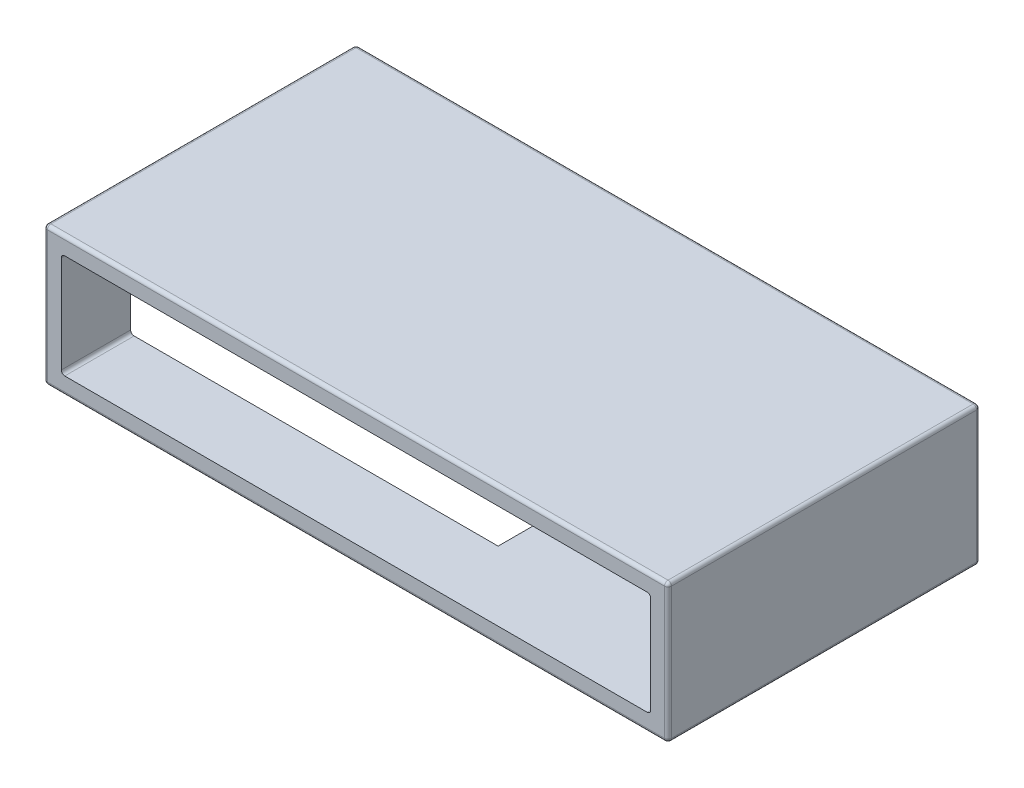
ISO-10303-21;
HEADER;
FILE_DESCRIPTION(('STEP AP214'),'2;1');
FILE_NAME('part.step','',(''),(''),'','','');
FILE_SCHEMA(('AUTOMOTIVE_DESIGN { 1 0 10303 214 1 1 1 1 }'));
ENDSEC;
DATA;
#1=APPLICATION_CONTEXT('core data for automotive mechanical design processes');
#2=APPLICATION_PROTOCOL_DEFINITION('international standard','automotive_design',2000,#1);
#3=PRODUCT_CONTEXT('',#1,'mechanical');
#4=PRODUCT('Part','Part','',(#3));
#5=PRODUCT_RELATED_PRODUCT_CATEGORY('part','',(#4));
#6=PRODUCT_DEFINITION_FORMATION('','',#4);
#7=PRODUCT_DEFINITION_CONTEXT('part definition',#1,'design');
#8=PRODUCT_DEFINITION('design','',#6,#7);
#9=PRODUCT_DEFINITION_SHAPE('','',#8);
#10=(LENGTH_UNIT() NAMED_UNIT(*) SI_UNIT(.MILLI.,.METRE.));
#11=(NAMED_UNIT(*) PLANE_ANGLE_UNIT() SI_UNIT($,.RADIAN.));
#12=(NAMED_UNIT(*) SI_UNIT($,.STERADIAN.) SOLID_ANGLE_UNIT());
#13=UNCERTAINTY_MEASURE_WITH_UNIT(LENGTH_MEASURE(1.E-05),#10,'distance_accuracy_value','');
#14=(GEOMETRIC_REPRESENTATION_CONTEXT(3) GLOBAL_UNCERTAINTY_ASSIGNED_CONTEXT((#13)) GLOBAL_UNIT_ASSIGNED_CONTEXT((#10,
#11,#12)) REPRESENTATION_CONTEXT('',''));
#15=CARTESIAN_POINT('',(0.,0.,0.));
#16=DIRECTION('',(0.,0.,1.));
#17=DIRECTION('',(1.,0.,0.));
#18=AXIS2_PLACEMENT_3D('',#15,#16,#17);
#19=CARTESIAN_POINT('',(-89.,-19.,90.));
#20=DIRECTION('',(0.,0.,-1.));
#21=DIRECTION('',(-1.,0.,0.));
#22=AXIS2_PLACEMENT_3D('',#19,#20,#21);
#23=CYLINDRICAL_SURFACE('',#22,1.);
#24=CARTESIAN_POINT('',(-89.,-19.,20.));
#25=DIRECTION('',(0.,0.,-1.));
#26=DIRECTION('',(0.,1.,0.));
#27=AXIS2_PLACEMENT_3D('',#24,#25,#26);
#28=CIRCLE('',#27,1.);
#29=CARTESIAN_POINT('',(-90.,-19.,20.));
#30=VERTEX_POINT('',#29);
#31=CARTESIAN_POINT('',(-89.,-20.,20.));
#32=VERTEX_POINT('',#31);
#33=EDGE_CURVE('E263',#30,#32,#28,.F.);
#34=ORIENTED_EDGE('',*,*,#33,.F.);
#35=DIRECTION('',(0.,0.,-1.));
#36=VECTOR('',#35,1.);
#37=CARTESIAN_POINT('',(-90.,-19.,90.));
#38=LINE('',#37,#36);
#39=CARTESIAN_POINT('',(-90.,-19.,1.));
#40=VERTEX_POINT('',#39);
#41=EDGE_CURVE('E431',#40,#30,#38,.F.);
#42=ORIENTED_EDGE('',*,*,#41,.F.);
#43=CARTESIAN_POINT('',(-89.,-19.,1.));
#44=DIRECTION('',(0.,0.,-1.));
#45=DIRECTION('',(-1.,0.,0.));
#46=AXIS2_PLACEMENT_3D('',#43,#44,#45);
#47=CIRCLE('',#46,1.);
#48=CARTESIAN_POINT('',(-89.,-20.,1.));
#49=VERTEX_POINT('',#48);
#50=EDGE_CURVE('E527',#49,#40,#47,.T.);
#51=ORIENTED_EDGE('',*,*,#50,.F.);
#52=DIRECTION('',(0.,0.,-1.));
#53=VECTOR('',#52,1.);
#54=CARTESIAN_POINT('',(-89.,-20.,90.));
#55=LINE('',#54,#53);
#56=EDGE_CURVE('E392',#32,#49,#55,.T.);
#57=ORIENTED_EDGE('',*,*,#56,.F.);
#58=EDGE_LOOP('',(#34,#42,#51,#57));
#59=FACE_BOUND('',#58,.T.);
#60=ADVANCED_FACE('F42',(#59),#23,.T.);
#61=CARTESIAN_POINT('',(-84.,-14.,90.));
#62=DIRECTION('',(0.,0.,1.));
#63=DIRECTION('',(1.,0.,0.));
#64=AXIS2_PLACEMENT_3D('',#61,#62,#63);
#65=CYLINDRICAL_SURFACE('',#64,1.);
#66=DIRECTION('',(0.,0.,-1.));
#67=VECTOR('',#66,1.);
#68=CARTESIAN_POINT('',(-84.,-15.,90.));
#69=LINE('',#68,#67);
#70=CARTESIAN_POINT('',(-84.,-15.,70.));
#71=VERTEX_POINT('',#70);
#72=CARTESIAN_POINT('',(-84.,-15.,90.));
#73=VERTEX_POINT('',#72);
#74=EDGE_CURVE('E361',#71,#73,#69,.F.);
#75=ORIENTED_EDGE('',*,*,#74,.F.);
#76=CARTESIAN_POINT('',(-84.,-14.,70.));
#77=DIRECTION('',(0.,0.,1.));
#78=DIRECTION('',(1.,0.,0.));
#79=AXIS2_PLACEMENT_3D('',#76,#77,#78);
#80=CIRCLE('',#79,1.);
#81=CARTESIAN_POINT('',(-85.,-14.,70.));
#82=VERTEX_POINT('',#81);
#83=EDGE_CURVE('E291',#71,#82,#80,.F.);
#84=ORIENTED_EDGE('',*,*,#83,.T.);
#85=DIRECTION('',(0.,0.,-1.));
#86=VECTOR('',#85,1.);
#87=CARTESIAN_POINT('',(-85.,-14.,0.));
#88=LINE('',#87,#86);
#89=CARTESIAN_POINT('',(-85.,-14.,90.));
#90=VERTEX_POINT('',#89);
#91=EDGE_CURVE('E350',#90,#82,#88,.T.);
#92=ORIENTED_EDGE('',*,*,#91,.F.);
#93=CARTESIAN_POINT('',(-84.,-14.,90.));
#94=DIRECTION('',(0.,0.,1.));
#95=DIRECTION('',(1.,0.,0.));
#96=AXIS2_PLACEMENT_3D('',#93,#94,#95);
#97=CIRCLE('',#96,1.);
#98=EDGE_CURVE('E462',#73,#90,#97,.F.);
#99=ORIENTED_EDGE('',*,*,#98,.F.);
#100=EDGE_LOOP('',(#75,#84,#92,#99));
#101=FACE_BOUND('',#100,.T.);
#102=ADVANCED_FACE('F581',(#101),#65,.F.);
#103=CARTESIAN_POINT('',(0.,0.,90.));
#104=DIRECTION('',(0.,0.,1.));
#105=DIRECTION('',(1.,0.,0.));
#106=AXIS2_PLACEMENT_3D('',#103,#104,#105);
#107=PLANE('',#106);
#108=DIRECTION('',(1.,0.,0.));
#109=VECTOR('',#108,1.);
#110=CARTESIAN_POINT('',(90.,-19.,90.));
#111=LINE('',#110,#109);
#112=CARTESIAN_POINT('',(-89.,-19.,90.));
#113=VERTEX_POINT('',#112);
#114=CARTESIAN_POINT('',(89.,-19.,90.));
#115=VERTEX_POINT('',#114);
#116=EDGE_CURVE('E413',#113,#115,#111,.T.);
#117=ORIENTED_EDGE('',*,*,#116,.T.);
#118=DIRECTION('',(0.,1.,0.));
#119=VECTOR('',#118,1.);
#120=CARTESIAN_POINT('',(89.,20.,90.));
#121=LINE('',#120,#119);
#122=CARTESIAN_POINT('',(89.,19.,90.));
#123=VERTEX_POINT('',#122);
#124=EDGE_CURVE('E416',#115,#123,#121,.T.);
#125=ORIENTED_EDGE('',*,*,#124,.T.);
#126=DIRECTION('',(-1.,0.,0.));
#127=VECTOR('',#126,1.);
#128=CARTESIAN_POINT('',(-90.,19.,90.));
#129=LINE('',#128,#127);
#130=CARTESIAN_POINT('',(-89.,19.,90.));
#131=VERTEX_POINT('',#130);
#132=EDGE_CURVE('E407',#123,#131,#129,.T.);
#133=ORIENTED_EDGE('',*,*,#132,.T.);
#134=DIRECTION('',(0.,-1.,0.));
#135=VECTOR('',#134,1.);
#136=CARTESIAN_POINT('',(-89.,-20.,90.));
#137=LINE('',#136,#135);
#138=EDGE_CURVE('E410',#131,#113,#137,.T.);
#139=ORIENTED_EDGE('',*,*,#138,.T.);
#140=EDGE_LOOP('',(#117,#125,#133,#139));
#141=FACE_BOUND('',#140,.T.);
#142=DIRECTION('',(-1.,0.,0.));
#143=VECTOR('',#142,1.);
#144=CARTESIAN_POINT('',(-85.,15.,90.));
#145=LINE('',#144,#143);
#146=CARTESIAN_POINT('',(84.,15.,90.));
#147=VERTEX_POINT('',#146);
#148=CARTESIAN_POINT('',(-84.,15.,90.));
#149=VERTEX_POINT('',#148);
#150=EDGE_CURVE('E306',#147,#149,#145,.T.);
#151=ORIENTED_EDGE('',*,*,#150,.F.);
#152=CARTESIAN_POINT('',(84.,14.,90.));
#153=DIRECTION('',(0.,0.,1.));
#154=DIRECTION('',(1.,0.,0.));
#155=AXIS2_PLACEMENT_3D('',#152,#153,#154);
#156=CIRCLE('',#155,1.);
#157=CARTESIAN_POINT('',(85.,14.,90.));
#158=VERTEX_POINT('',#157);
#159=EDGE_CURVE('E450',#147,#158,#156,.F.);
#160=ORIENTED_EDGE('',*,*,#159,.T.);
#161=DIRECTION('',(0.,1.,0.));
#162=VECTOR('',#161,1.);
#163=CARTESIAN_POINT('',(85.,15.,90.));
#164=LINE('',#163,#162);
#165=CARTESIAN_POINT('',(85.,-14.,90.));
#166=VERTEX_POINT('',#165);
#167=EDGE_CURVE('E302',#166,#158,#164,.T.);
#168=ORIENTED_EDGE('',*,*,#167,.F.);
#169=CARTESIAN_POINT('',(84.,-14.,90.));
#170=DIRECTION('',(0.,0.,1.));
#171=DIRECTION('',(1.,0.,0.));
#172=AXIS2_PLACEMENT_3D('',#169,#170,#171);
#173=CIRCLE('',#172,1.);
#174=CARTESIAN_POINT('',(84.,-15.,90.));
#175=VERTEX_POINT('',#174);
#176=EDGE_CURVE('E468',#166,#175,#173,.F.);
#177=ORIENTED_EDGE('',*,*,#176,.T.);
#178=DIRECTION('',(1.,0.,0.));
#179=VECTOR('',#178,1.);
#180=CARTESIAN_POINT('',(-85.,-15.,90.));
#181=LINE('',#180,#179);
#182=EDGE_CURVE('E315',#73,#175,#181,.T.);
#183=ORIENTED_EDGE('',*,*,#182,.F.);
#184=ORIENTED_EDGE('',*,*,#98,.T.);
#185=DIRECTION('',(0.,-1.,0.));
#186=VECTOR('',#185,1.);
#187=CARTESIAN_POINT('',(-85.,15.,90.));
#188=LINE('',#187,#186);
#189=CARTESIAN_POINT('',(-85.,14.,90.));
#190=VERTEX_POINT('',#189);
#191=EDGE_CURVE('E311',#190,#90,#188,.T.);
#192=ORIENTED_EDGE('',*,*,#191,.F.);
#193=CARTESIAN_POINT('',(-84.,14.,90.));
#194=DIRECTION('',(0.,0.,1.));
#195=DIRECTION('',(1.,0.,0.));
#196=AXIS2_PLACEMENT_3D('',#193,#194,#195);
#197=CIRCLE('',#196,1.);
#198=EDGE_CURVE('E456',#190,#149,#197,.F.);
#199=ORIENTED_EDGE('',*,*,#198,.T.);
#200=EDGE_LOOP('',(#151,#160,#168,#177,#183,#184,#192,#199));
#201=FACE_BOUND('',#200,.T.);
#202=ADVANCED_FACE('F611',(#141,#201),#107,.T.);
#203=CARTESIAN_POINT('',(0.,0.,0.));
#204=DIRECTION('',(0.,0.,1.));
#205=DIRECTION('',(1.,0.,0.));
#206=AXIS2_PLACEMENT_3D('',#203,#204,#205);
#207=PLANE('',#206);
#208=DIRECTION('',(-1.,0.,0.));
#209=VECTOR('',#208,1.);
#210=CARTESIAN_POINT('',(0.,19.,0.));
#211=LINE('',#210,#209);
#212=CARTESIAN_POINT('',(-89.,19.,0.));
#213=VERTEX_POINT('',#212);
#214=CARTESIAN_POINT('',(89.,19.,0.));
#215=VERTEX_POINT('',#214);
#216=EDGE_CURVE('E379',#213,#215,#211,.F.);
#217=ORIENTED_EDGE('',*,*,#216,.T.);
#218=DIRECTION('',(0.,1.,0.));
#219=VECTOR('',#218,1.);
#220=CARTESIAN_POINT('',(89.,0.,0.));
#221=LINE('',#220,#219);
#222=CARTESIAN_POINT('',(89.,-19.,0.));
#223=VERTEX_POINT('',#222);
#224=EDGE_CURVE('E388',#215,#223,#221,.F.);
#225=ORIENTED_EDGE('',*,*,#224,.T.);
#226=DIRECTION('',(1.,0.,0.));
#227=VECTOR('',#226,1.);
#228=CARTESIAN_POINT('',(0.,-19.,0.));
#229=LINE('',#228,#227);
#230=CARTESIAN_POINT('',(-89.,-19.,0.));
#231=VERTEX_POINT('',#230);
#232=EDGE_CURVE('E385',#223,#231,#229,.F.);
#233=ORIENTED_EDGE('',*,*,#232,.T.);
#234=DIRECTION('',(0.,-1.,0.));
#235=VECTOR('',#234,1.);
#236=CARTESIAN_POINT('',(-89.,0.,0.));
#237=LINE('',#236,#235);
#238=EDGE_CURVE('E382',#231,#213,#237,.F.);
#239=ORIENTED_EDGE('',*,*,#238,.T.);
#240=EDGE_LOOP('',(#217,#225,#233,#239));
#241=FACE_BOUND('',#240,.T.);
#242=DIRECTION('',(1.,0.,0.));
#243=VECTOR('',#242,1.);
#244=CARTESIAN_POINT('',(-85.,-15.,0.));
#245=LINE('',#244,#243);
#246=CARTESIAN_POINT('',(-84.,-15.,0.));
#247=VERTEX_POINT('',#246);
#248=CARTESIAN_POINT('',(84.,-15.,0.));
#249=VERTEX_POINT('',#248);
#250=EDGE_CURVE('E307',#247,#249,#245,.T.);
#251=ORIENTED_EDGE('',*,*,#250,.T.);
#252=CARTESIAN_POINT('',(84.,-14.,0.));
#253=DIRECTION('',(0.,0.,1.));
#254=DIRECTION('',(1.,0.,0.));
#255=AXIS2_PLACEMENT_3D('',#252,#253,#254);
#256=CIRCLE('',#255,1.);
#257=CARTESIAN_POINT('',(85.,-14.,0.));
#258=VERTEX_POINT('',#257);
#259=EDGE_CURVE('E465',#249,#258,#256,.T.);
#260=ORIENTED_EDGE('',*,*,#259,.T.);
#261=DIRECTION('',(0.,1.,0.));
#262=VECTOR('',#261,1.);
#263=CARTESIAN_POINT('',(85.,15.,0.));
#264=LINE('',#263,#262);
#265=CARTESIAN_POINT('',(85.,14.,0.));
#266=VERTEX_POINT('',#265);
#267=EDGE_CURVE('E320',#258,#266,#264,.T.);
#268=ORIENTED_EDGE('',*,*,#267,.T.);
#269=CARTESIAN_POINT('',(84.,14.,0.));
#270=DIRECTION('',(0.,0.,1.));
#271=DIRECTION('',(1.,0.,0.));
#272=AXIS2_PLACEMENT_3D('',#269,#270,#271);
#273=CIRCLE('',#272,1.);
#274=CARTESIAN_POINT('',(84.,15.,0.));
#275=VERTEX_POINT('',#274);
#276=EDGE_CURVE('E447',#266,#275,#273,.T.);
#277=ORIENTED_EDGE('',*,*,#276,.T.);
#278=DIRECTION('',(-1.,0.,0.));
#279=VECTOR('',#278,1.);
#280=CARTESIAN_POINT('',(-85.,15.,0.));
#281=LINE('',#280,#279);
#282=CARTESIAN_POINT('',(-84.,15.,0.));
#283=VERTEX_POINT('',#282);
#284=EDGE_CURVE('E324',#275,#283,#281,.T.);
#285=ORIENTED_EDGE('',*,*,#284,.T.);
#286=CARTESIAN_POINT('',(-84.,14.,0.));
#287=DIRECTION('',(0.,0.,1.));
#288=DIRECTION('',(1.,0.,0.));
#289=AXIS2_PLACEMENT_3D('',#286,#287,#288);
#290=CIRCLE('',#289,1.);
#291=CARTESIAN_POINT('',(-85.,14.,0.));
#292=VERTEX_POINT('',#291);
#293=EDGE_CURVE('E453',#283,#292,#290,.T.);
#294=ORIENTED_EDGE('',*,*,#293,.T.);
#295=DIRECTION('',(0.,-1.,0.));
#296=VECTOR('',#295,1.);
#297=CARTESIAN_POINT('',(-85.,15.,0.));
#298=LINE('',#297,#296);
#299=CARTESIAN_POINT('',(-85.,-14.,0.));
#300=VERTEX_POINT('',#299);
#301=EDGE_CURVE('E329',#292,#300,#298,.T.);
#302=ORIENTED_EDGE('',*,*,#301,.T.);
#303=CARTESIAN_POINT('',(-84.,-14.,0.));
#304=DIRECTION('',(0.,0.,1.));
#305=DIRECTION('',(1.,0.,0.));
#306=AXIS2_PLACEMENT_3D('',#303,#304,#305);
#307=CIRCLE('',#306,1.);
#308=EDGE_CURVE('E459',#300,#247,#307,.T.);
#309=ORIENTED_EDGE('',*,*,#308,.T.);
#310=EDGE_LOOP('',(#251,#260,#268,#277,#285,#294,#302,#309));
#311=FACE_BOUND('',#310,.T.);
#312=ADVANCED_FACE('F1078',(#241,#311),#207,.F.);
#313=CARTESIAN_POINT('',(90.,20.,90.));
#314=DIRECTION('',(-1.,0.,0.));
#315=DIRECTION('',(0.,0.,1.));
#316=AXIS2_PLACEMENT_3D('',#313,#314,#315);
#317=PLANE('',#316);
#318=DIRECTION('',(0.,0.,-1.));
#319=VECTOR('',#318,1.);
#320=CARTESIAN_POINT('',(90.,-19.,90.));
#321=LINE('',#320,#319);
#322=CARTESIAN_POINT('',(90.,-19.,89.));
#323=VERTEX_POINT('',#322);
#324=CARTESIAN_POINT('',(90.,-19.,1.));
#325=VERTEX_POINT('',#324);
#326=EDGE_CURVE('E372',#323,#325,#321,.T.);
#327=ORIENTED_EDGE('',*,*,#326,.T.);
#328=DIRECTION('',(0.,1.,0.));
#329=VECTOR('',#328,1.);
#330=CARTESIAN_POINT('',(90.,20.,1.));
#331=LINE('',#330,#329);
#332=CARTESIAN_POINT('',(90.,19.,1.));
#333=VERTEX_POINT('',#332);
#334=EDGE_CURVE('E375',#325,#333,#331,.T.);
#335=ORIENTED_EDGE('',*,*,#334,.T.);
#336=DIRECTION('',(0.,0.,-1.));
#337=VECTOR('',#336,1.);
#338=CARTESIAN_POINT('',(90.,19.,90.));
#339=LINE('',#338,#337);
#340=CARTESIAN_POINT('',(90.,19.,89.));
#341=VERTEX_POINT('',#340);
#342=EDGE_CURVE('E366',#333,#341,#339,.F.);
#343=ORIENTED_EDGE('',*,*,#342,.T.);
#344=DIRECTION('',(0.,1.,0.));
#345=VECTOR('',#344,1.);
#346=CARTESIAN_POINT('',(90.,-20.,89.));
#347=LINE('',#346,#345);
#348=EDGE_CURVE('E369',#341,#323,#347,.F.);
#349=ORIENTED_EDGE('',*,*,#348,.T.);
#350=EDGE_LOOP('',(#327,#335,#343,#349));
#351=FACE_BOUND('',#350,.T.);
#352=ADVANCED_FACE('F666',(#351),#317,.F.);
#353=CARTESIAN_POINT('',(-90.,20.,90.));
#354=DIRECTION('',(0.,-1.,0.));
#355=DIRECTION('',(0.,0.,-1.));
#356=AXIS2_PLACEMENT_3D('',#353,#354,#355);
#357=PLANE('',#356);
#358=DIRECTION('',(-1.,0.,0.));
#359=VECTOR('',#358,1.);
#360=CARTESIAN_POINT('',(90.,20.,89.));
#361=LINE('',#360,#359);
#362=CARTESIAN_POINT('',(-89.,20.,89.));
#363=VERTEX_POINT('',#362);
#364=CARTESIAN_POINT('',(89.,20.,89.));
#365=VERTEX_POINT('',#364);
#366=EDGE_CURVE('E437',#363,#365,#361,.F.);
#367=ORIENTED_EDGE('',*,*,#366,.T.);
#368=DIRECTION('',(0.,0.,-1.));
#369=VECTOR('',#368,1.);
#370=CARTESIAN_POINT('',(89.,20.,90.));
#371=LINE('',#370,#369);
#372=CARTESIAN_POINT('',(89.,20.,1.));
#373=VERTEX_POINT('',#372);
#374=EDGE_CURVE('E443',#365,#373,#371,.T.);
#375=ORIENTED_EDGE('',*,*,#374,.T.);
#376=DIRECTION('',(-1.,0.,0.));
#377=VECTOR('',#376,1.);
#378=CARTESIAN_POINT('',(-90.,20.,1.));
#379=LINE('',#378,#377);
#380=CARTESIAN_POINT('',(-89.,20.,1.));
#381=VERTEX_POINT('',#380);
#382=EDGE_CURVE('E440',#373,#381,#379,.T.);
#383=ORIENTED_EDGE('',*,*,#382,.T.);
#384=DIRECTION('',(0.,0.,-1.));
#385=VECTOR('',#384,1.);
#386=CARTESIAN_POINT('',(-89.,20.,90.));
#387=LINE('',#386,#385);
#388=EDGE_CURVE('E434',#381,#363,#387,.F.);
#389=ORIENTED_EDGE('',*,*,#388,.T.);
#390=EDGE_LOOP('',(#367,#375,#383,#389));
#391=FACE_BOUND('',#390,.T.);
#392=ADVANCED_FACE('F1059',(#391),#357,.F.);
#393=CARTESIAN_POINT('',(-90.,20.,90.));
#394=DIRECTION('',(1.,0.,0.));
#395=DIRECTION('',(0.,0.,-1.));
#396=AXIS2_PLACEMENT_3D('',#393,#394,#395);
#397=PLANE('',#396);
#398=CARTESIAN_POINT('',(-90.,-6.5921164803269,10.));
#399=DIRECTION('',(-1.,0.,0.));
#400=DIRECTION('',(0.,0.,1.));
#401=AXIS2_PLACEMENT_3D('',#398,#399,#400);
#402=CIRCLE('',#401,2.5);
#403=CARTESIAN_POINT('',(-90.,-6.5921164803269,12.5));
#404=VERTEX_POINT('',#403);
#405=EDGE_CURVE('E1164',#404,#404,#402,.T.);
#406=ORIENTED_EDGE('',*,*,#405,.F.);
#407=EDGE_LOOP('',(#406));
#408=FACE_BOUND('',#407,.T.);
#409=CARTESIAN_POINT('',(-90.,-6.59211648032689,80.));
#410=DIRECTION('',(-1.,0.,0.));
#411=DIRECTION('',(0.,0.,-1.));
#412=AXIS2_PLACEMENT_3D('',#409,#410,#411);
#413=CIRCLE('',#412,2.50000000000001);
#414=CARTESIAN_POINT('',(-90.,-6.59211648032689,77.5));
#415=VERTEX_POINT('',#414);
#416=EDGE_CURVE('E1167',#415,#415,#413,.T.);
#417=ORIENTED_EDGE('',*,*,#416,.F.);
#418=EDGE_LOOP('',(#417));
#419=FACE_BOUND('',#418,.T.);
#420=ORIENTED_EDGE('',*,*,#41,.T.);
#421=DIRECTION('',(0.,-1.,0.));
#422=VECTOR('',#421,1.);
#423=CARTESIAN_POINT('',(-90.,-20.,20.));
#424=LINE('',#423,#422);
#425=CARTESIAN_POINT('',(-90.,10.,20.));
#426=VERTEX_POINT('',#425);
#427=EDGE_CURVE('E251',#426,#30,#424,.T.);
#428=ORIENTED_EDGE('',*,*,#427,.F.);
#429=DIRECTION('',(0.,0.,-1.));
#430=VECTOR('',#429,1.);
#431=CARTESIAN_POINT('',(-90.,10.,20.));
#432=LINE('',#431,#430);
#433=CARTESIAN_POINT('',(-90.,10.,70.));
#434=VERTEX_POINT('',#433);
#435=EDGE_CURVE('E236',#434,#426,#432,.T.);
#436=ORIENTED_EDGE('',*,*,#435,.F.);
#437=DIRECTION('',(0.,1.,0.));
#438=VECTOR('',#437,1.);
#439=CARTESIAN_POINT('',(-90.,-20.,70.));
#440=LINE('',#439,#438);
#441=CARTESIAN_POINT('',(-90.,-19.,70.));
#442=VERTEX_POINT('',#441);
#443=EDGE_CURVE('E244',#442,#434,#440,.T.);
#444=ORIENTED_EDGE('',*,*,#443,.F.);
#445=CARTESIAN_POINT('',(-90.,-19.,89.));
#446=VERTEX_POINT('',#445);
#447=EDGE_CURVE('E430',#442,#446,#38,.F.);
#448=ORIENTED_EDGE('',*,*,#447,.T.);
#449=DIRECTION('',(0.,-1.,0.));
#450=VECTOR('',#449,1.);
#451=CARTESIAN_POINT('',(-90.,20.,89.));
#452=LINE('',#451,#450);
#453=CARTESIAN_POINT('',(-90.,19.,89.));
#454=VERTEX_POINT('',#453);
#455=EDGE_CURVE('E426',#446,#454,#452,.F.);
#456=ORIENTED_EDGE('',*,*,#455,.T.);
#457=DIRECTION('',(0.,0.,-1.));
#458=VECTOR('',#457,1.);
#459=CARTESIAN_POINT('',(-90.,19.,90.));
#460=LINE('',#459,#458);
#461=CARTESIAN_POINT('',(-90.,19.,1.));
#462=VERTEX_POINT('',#461);
#463=EDGE_CURVE('E420',#454,#462,#460,.T.);
#464=ORIENTED_EDGE('',*,*,#463,.T.);
#465=DIRECTION('',(0.,-1.,0.));
#466=VECTOR('',#465,1.);
#467=CARTESIAN_POINT('',(-90.,20.,1.));
#468=LINE('',#467,#466);
#469=EDGE_CURVE('E423',#462,#40,#468,.T.);
#470=ORIENTED_EDGE('',*,*,#469,.T.);
#471=EDGE_LOOP('',(#420,#428,#436,#444,#448,#456,#464,#470));
#472=FACE_BOUND('',#471,.T.);
#473=ADVANCED_FACE('F254',(#408,#419,#472),#397,.F.);
#474=CARTESIAN_POINT('',(-90.,-20.,90.));
#475=DIRECTION('',(0.,1.,0.));
#476=DIRECTION('',(0.,0.,1.));
#477=AXIS2_PLACEMENT_3D('',#474,#475,#476);
#478=PLANE('',#477);
#479=CARTESIAN_POINT('',(-89.,-20.,89.));
#480=VERTEX_POINT('',#479);
#481=CARTESIAN_POINT('',(-89.,-20.,70.));
#482=VERTEX_POINT('',#481);
#483=EDGE_CURVE('E393',#480,#482,#55,.T.);
#484=ORIENTED_EDGE('',*,*,#483,.T.);
#485=DIRECTION('',(-1.,0.,0.));
#486=VECTOR('',#485,1.);
#487=CARTESIAN_POINT('',(-89.,-20.,70.));
#488=LINE('',#487,#486);
#489=CARTESIAN_POINT('',(21.,-20.,70.));
#490=VERTEX_POINT('',#489);
#491=EDGE_CURVE('E266',#490,#482,#488,.T.);
#492=ORIENTED_EDGE('',*,*,#491,.F.);
#493=DIRECTION('',(0.,0.,1.));
#494=VECTOR('',#493,1.);
#495=CARTESIAN_POINT('',(21.,-20.,70.));
#496=LINE('',#495,#494);
#497=CARTESIAN_POINT('',(21.,-20.,20.));
#498=VERTEX_POINT('',#497);
#499=EDGE_CURVE('E272',#498,#490,#496,.T.);
#500=ORIENTED_EDGE('',*,*,#499,.F.);
#501=DIRECTION('',(1.,0.,0.));
#502=VECTOR('',#501,1.);
#503=CARTESIAN_POINT('',(-89.,-20.,20.));
#504=LINE('',#503,#502);
#505=EDGE_CURVE('E269',#32,#498,#504,.T.);
#506=ORIENTED_EDGE('',*,*,#505,.F.);
#507=ORIENTED_EDGE('',*,*,#56,.T.);
#508=DIRECTION('',(1.,0.,0.));
#509=VECTOR('',#508,1.);
#510=CARTESIAN_POINT('',(-90.,-20.,1.));
#511=LINE('',#510,#509);
#512=CARTESIAN_POINT('',(89.,-20.,1.));
#513=VERTEX_POINT('',#512);
#514=EDGE_CURVE('E400',#49,#513,#511,.T.);
#515=ORIENTED_EDGE('',*,*,#514,.T.);
#516=DIRECTION('',(0.,0.,-1.));
#517=VECTOR('',#516,1.);
#518=CARTESIAN_POINT('',(89.,-20.,90.));
#519=LINE('',#518,#517);
#520=CARTESIAN_POINT('',(89.,-20.,89.));
#521=VERTEX_POINT('',#520);
#522=EDGE_CURVE('E403',#513,#521,#519,.F.);
#523=ORIENTED_EDGE('',*,*,#522,.T.);
#524=DIRECTION('',(1.,0.,0.));
#525=VECTOR('',#524,1.);
#526=CARTESIAN_POINT('',(-90.,-20.,89.));
#527=LINE('',#526,#525);
#528=EDGE_CURVE('E397',#521,#480,#527,.F.);
#529=ORIENTED_EDGE('',*,*,#528,.T.);
#530=EDGE_LOOP('',(#484,#492,#500,#506,#507,#515,#523,#529));
#531=FACE_BOUND('',#530,.T.);
#532=ADVANCED_FACE('F603',(#531),#478,.F.);
#533=CARTESIAN_POINT('',(85.,15.,90.));
#534=DIRECTION('',(-1.,0.,0.));
#535=DIRECTION('',(0.,0.,1.));
#536=AXIS2_PLACEMENT_3D('',#533,#534,#535);
#537=PLANE('',#536);
#538=ORIENTED_EDGE('',*,*,#167,.T.);
#539=DIRECTION('',(0.,0.,-1.));
#540=VECTOR('',#539,1.);
#541=CARTESIAN_POINT('',(85.,14.,0.));
#542=LINE('',#541,#540);
#543=EDGE_CURVE('E338',#158,#266,#542,.T.);
#544=ORIENTED_EDGE('',*,*,#543,.T.);
#545=ORIENTED_EDGE('',*,*,#267,.F.);
#546=DIRECTION('',(0.,0.,-1.));
#547=VECTOR('',#546,1.);
#548=CARTESIAN_POINT('',(85.,-14.,90.));
#549=LINE('',#548,#547);
#550=EDGE_CURVE('E319',#258,#166,#549,.F.);
#551=ORIENTED_EDGE('',*,*,#550,.T.);
#552=EDGE_LOOP('',(#538,#544,#545,#551));
#553=FACE_BOUND('',#552,.T.);
#554=ADVANCED_FACE('F1034',(#553),#537,.T.);
#555=CARTESIAN_POINT('',(-85.,15.,90.));
#556=DIRECTION('',(0.,-1.,0.));
#557=DIRECTION('',(0.,0.,-1.));
#558=AXIS2_PLACEMENT_3D('',#555,#556,#557);
#559=PLANE('',#558);
#560=ORIENTED_EDGE('',*,*,#284,.F.);
#561=DIRECTION('',(0.,0.,-1.));
#562=VECTOR('',#561,1.);
#563=CARTESIAN_POINT('',(84.,15.,90.));
#564=LINE('',#563,#562);
#565=EDGE_CURVE('E346',#275,#147,#564,.F.);
#566=ORIENTED_EDGE('',*,*,#565,.T.);
#567=ORIENTED_EDGE('',*,*,#150,.T.);
#568=DIRECTION('',(0.,0.,-1.));
#569=VECTOR('',#568,1.);
#570=CARTESIAN_POINT('',(-84.,15.,0.));
#571=LINE('',#570,#569);
#572=EDGE_CURVE('E342',#149,#283,#571,.T.);
#573=ORIENTED_EDGE('',*,*,#572,.T.);
#574=EDGE_LOOP('',(#560,#566,#567,#573));
#575=FACE_BOUND('',#574,.T.);
#576=ADVANCED_FACE('F1025',(#575),#559,.T.);
#577=CARTESIAN_POINT('',(-85.,15.,90.));
#578=DIRECTION('',(1.,0.,0.));
#579=DIRECTION('',(0.,1.,0.));
#580=AXIS2_PLACEMENT_3D('',#577,#578,#579);
#581=PLANE('',#580);
#582=DIRECTION('',(0.,0.,1.));
#583=VECTOR('',#582,1.);
#584=CARTESIAN_POINT('',(-85.,10.,90.));
#585=LINE('',#584,#583);
#586=CARTESIAN_POINT('',(-85.,10.,20.));
#587=VERTEX_POINT('',#586);
#588=CARTESIAN_POINT('',(-85.,10.,70.));
#589=VERTEX_POINT('',#588);
#590=EDGE_CURVE('E11',#587,#589,#585,.T.);
#591=ORIENTED_EDGE('',*,*,#590,.F.);
#592=DIRECTION('',(0.,1.,0.));
#593=VECTOR('',#592,1.);
#594=CARTESIAN_POINT('',(-85.,15.,20.));
#595=LINE('',#594,#593);
#596=CARTESIAN_POINT('',(-85.,-14.,20.));
#597=VERTEX_POINT('',#596);
#598=EDGE_CURVE('E288',#597,#587,#595,.T.);
#599=ORIENTED_EDGE('',*,*,#598,.F.);
#600=EDGE_CURVE('E349',#597,#300,#88,.T.);
#601=ORIENTED_EDGE('',*,*,#600,.T.);
#602=ORIENTED_EDGE('',*,*,#301,.F.);
#603=DIRECTION('',(0.,0.,-1.));
#604=VECTOR('',#603,1.);
#605=CARTESIAN_POINT('',(-85.,14.,90.));
#606=LINE('',#605,#604);
#607=EDGE_CURVE('E354',#292,#190,#606,.F.);
#608=ORIENTED_EDGE('',*,*,#607,.T.);
#609=ORIENTED_EDGE('',*,*,#191,.T.);
#610=ORIENTED_EDGE('',*,*,#91,.T.);
#611=DIRECTION('',(0.,-1.,0.));
#612=VECTOR('',#611,1.);
#613=CARTESIAN_POINT('',(-85.,15.,70.));
#614=LINE('',#613,#612);
#615=EDGE_CURVE('E298',#589,#82,#614,.T.);
#616=ORIENTED_EDGE('',*,*,#615,.F.);
#617=EDGE_LOOP('',(#591,#599,#601,#602,#608,#609,#610,#616));
#618=FACE_BOUND('',#617,.T.);
#619=ADVANCED_FACE('F576',(#618),#581,.T.);
#620=CARTESIAN_POINT('',(-85.,-15.,90.));
#621=DIRECTION('',(0.,1.,0.));
#622=DIRECTION('',(0.,0.,1.));
#623=AXIS2_PLACEMENT_3D('',#620,#621,#622);
#624=PLANE('',#623);
#625=DIRECTION('',(1.,0.,0.));
#626=VECTOR('',#625,1.);
#627=CARTESIAN_POINT('',(-85.,-15.,70.));
#628=LINE('',#627,#626);
#629=CARTESIAN_POINT('',(21.,-15.,70.));
#630=VERTEX_POINT('',#629);
#631=EDGE_CURVE('E295',#71,#630,#628,.T.);
#632=ORIENTED_EDGE('',*,*,#631,.F.);
#633=ORIENTED_EDGE('',*,*,#74,.T.);
#634=ORIENTED_EDGE('',*,*,#182,.T.);
#635=DIRECTION('',(0.,0.,-1.));
#636=VECTOR('',#635,1.);
#637=CARTESIAN_POINT('',(84.,-15.,0.));
#638=LINE('',#637,#636);
#639=EDGE_CURVE('E357',#175,#249,#638,.T.);
#640=ORIENTED_EDGE('',*,*,#639,.T.);
#641=ORIENTED_EDGE('',*,*,#250,.F.);
#642=CARTESIAN_POINT('',(-84.,-15.,20.));
#643=VERTEX_POINT('',#642);
#644=EDGE_CURVE('E362',#247,#643,#69,.F.);
#645=ORIENTED_EDGE('',*,*,#644,.T.);
#646=DIRECTION('',(-1.,0.,0.));
#647=VECTOR('',#646,1.);
#648=CARTESIAN_POINT('',(-85.,-15.,20.));
#649=LINE('',#648,#647);
#650=CARTESIAN_POINT('',(21.,-15.,20.));
#651=VERTEX_POINT('',#650);
#652=EDGE_CURVE('E58',#651,#643,#649,.T.);
#653=ORIENTED_EDGE('',*,*,#652,.F.);
#654=DIRECTION('',(0.,0.,-1.));
#655=VECTOR('',#654,1.);
#656=CARTESIAN_POINT('',(21.,-15.,90.));
#657=LINE('',#656,#655);
#658=EDGE_CURVE('E51',#630,#651,#657,.T.);
#659=ORIENTED_EDGE('',*,*,#658,.F.);
#660=EDGE_LOOP('',(#632,#633,#634,#640,#641,#645,#653,#659));
#661=FACE_BOUND('',#660,.T.);
#662=ADVANCED_FACE('F567',(#661),#624,.T.);
#663=CARTESIAN_POINT('',(84.,14.,90.));
#664=DIRECTION('',(0.,0.,1.));
#665=DIRECTION('',(1.,0.,0.));
#666=AXIS2_PLACEMENT_3D('',#663,#664,#665);
#667=CYLINDRICAL_SURFACE('',#666,1.);
#668=ORIENTED_EDGE('',*,*,#159,.F.);
#669=ORIENTED_EDGE('',*,*,#565,.F.);
#670=ORIENTED_EDGE('',*,*,#276,.F.);
#671=ORIENTED_EDGE('',*,*,#543,.F.);
#672=EDGE_LOOP('',(#668,#669,#670,#671));
#673=FACE_BOUND('',#672,.T.);
#674=ADVANCED_FACE('F1000',(#673),#667,.F.);
#675=CARTESIAN_POINT('',(-84.,14.,90.));
#676=DIRECTION('',(0.,0.,1.));
#677=DIRECTION('',(1.,0.,0.));
#678=AXIS2_PLACEMENT_3D('',#675,#676,#677);
#679=CYLINDRICAL_SURFACE('',#678,1.);
#680=ORIENTED_EDGE('',*,*,#198,.F.);
#681=ORIENTED_EDGE('',*,*,#607,.F.);
#682=ORIENTED_EDGE('',*,*,#293,.F.);
#683=ORIENTED_EDGE('',*,*,#572,.F.);
#684=EDGE_LOOP('',(#680,#681,#682,#683));
#685=FACE_BOUND('',#684,.T.);
#686=ADVANCED_FACE('F718',(#685),#679,.F.);
#687=ORIENTED_EDGE('',*,*,#600,.F.);
#688=CARTESIAN_POINT('',(-84.,-14.,20.));
#689=DIRECTION('',(0.,0.,-1.));
#690=DIRECTION('',(-1.,0.,0.));
#691=AXIS2_PLACEMENT_3D('',#688,#689,#690);
#692=CIRCLE('',#691,1.);
#693=EDGE_CURVE('E280',#597,#643,#692,.F.);
#694=ORIENTED_EDGE('',*,*,#693,.T.);
#695=ORIENTED_EDGE('',*,*,#644,.F.);
#696=ORIENTED_EDGE('',*,*,#308,.F.);
#697=EDGE_LOOP('',(#687,#694,#695,#696));
#698=FACE_BOUND('',#697,.T.);
#699=ADVANCED_FACE('F573',(#698),#65,.F.);
#700=CARTESIAN_POINT('',(84.,-14.,90.));
#701=DIRECTION('',(0.,0.,1.));
#702=DIRECTION('',(1.,0.,0.));
#703=AXIS2_PLACEMENT_3D('',#700,#701,#702);
#704=CYLINDRICAL_SURFACE('',#703,1.);
#705=ORIENTED_EDGE('',*,*,#176,.F.);
#706=ORIENTED_EDGE('',*,*,#550,.F.);
#707=ORIENTED_EDGE('',*,*,#259,.F.);
#708=ORIENTED_EDGE('',*,*,#639,.F.);
#709=EDGE_LOOP('',(#705,#706,#707,#708));
#710=FACE_BOUND('',#709,.T.);
#711=ADVANCED_FACE('F708',(#710),#704,.F.);
#712=CARTESIAN_POINT('',(-89.,0.,89.));
#713=DIRECTION('',(0.,1.,0.));
#714=DIRECTION('',(0.,0.,1.));
#715=AXIS2_PLACEMENT_3D('',#712,#713,#714);
#716=CYLINDRICAL_SURFACE('',#715,1.);
#717=CARTESIAN_POINT('',(-89.,-19.,89.));
#718=DIRECTION('',(0.,-1.,0.));
#719=DIRECTION('',(0.,0.,-1.));
#720=AXIS2_PLACEMENT_3D('',#717,#718,#719);
#721=CIRCLE('',#720,1.);
#722=EDGE_CURVE('E325',#113,#446,#721,.T.);
#723=ORIENTED_EDGE('',*,*,#722,.F.);
#724=ORIENTED_EDGE('',*,*,#138,.F.);
#725=CARTESIAN_POINT('',(-89.,19.,89.));
#726=DIRECTION('',(0.,1.,0.));
#727=DIRECTION('',(0.,0.,1.));
#728=AXIS2_PLACEMENT_3D('',#725,#726,#727);
#729=CIRCLE('',#728,1.);
#730=EDGE_CURVE('E551',#454,#131,#729,.T.);
#731=ORIENTED_EDGE('',*,*,#730,.F.);
#732=ORIENTED_EDGE('',*,*,#455,.F.);
#733=EDGE_LOOP('',(#723,#724,#731,#732));
#734=FACE_BOUND('',#733,.T.);
#735=ADVANCED_FACE('F44',(#734),#716,.T.);
#736=CARTESIAN_POINT('',(-89.,-19.,89.));
#737=DIRECTION('',(-1.,0.,0.));
#738=DIRECTION('',(0.,0.,1.));
#739=AXIS2_PLACEMENT_3D('',#736,#737,#738);
#740=SPHERICAL_SURFACE('',#739,1.);
#741=CARTESIAN_POINT('',(-89.,-19.,89.));
#742=DIRECTION('',(-1.,0.,0.));
#743=DIRECTION('',(0.,0.,1.));
#744=AXIS2_PLACEMENT_3D('',#741,#742,#743);
#745=CIRCLE('',#744,1.);
#746=EDGE_CURVE('E543',#113,#480,#745,.F.);
#747=ORIENTED_EDGE('',*,*,#746,.F.);
#748=ORIENTED_EDGE('',*,*,#722,.T.);
#749=CARTESIAN_POINT('',(-89.,-19.,89.));
#750=DIRECTION('',(0.,0.,1.));
#751=DIRECTION('',(1.,0.,0.));
#752=AXIS2_PLACEMENT_3D('',#749,#750,#751);
#753=CIRCLE('',#752,1.);
#754=EDGE_CURVE('E547',#480,#446,#753,.F.);
#755=ORIENTED_EDGE('',*,*,#754,.F.);
#756=EDGE_LOOP('',(#747,#748,#755));
#757=FACE_BOUND('',#756,.T.);
#758=ADVANCED_FACE('F597',(#757),#740,.T.);
#759=CARTESIAN_POINT('',(-89.,19.,89.));
#760=DIRECTION('',(0.,0.,1.));
#761=DIRECTION('',(1.,0.,0.));
#762=AXIS2_PLACEMENT_3D('',#759,#760,#761);
#763=SPHERICAL_SURFACE('',#762,1.);
#764=CARTESIAN_POINT('',(-89.,19.,89.));
#765=DIRECTION('',(0.,0.,1.));
#766=DIRECTION('',(1.,0.,0.));
#767=AXIS2_PLACEMENT_3D('',#764,#765,#766);
#768=CIRCLE('',#767,1.);
#769=EDGE_CURVE('E535',#454,#363,#768,.F.);
#770=ORIENTED_EDGE('',*,*,#769,.F.);
#771=ORIENTED_EDGE('',*,*,#730,.T.);
#772=CARTESIAN_POINT('',(-89.,19.,89.));
#773=DIRECTION('',(-1.,0.,0.));
#774=DIRECTION('',(0.,0.,1.));
#775=AXIS2_PLACEMENT_3D('',#772,#773,#774);
#776=CIRCLE('',#775,1.);
#777=EDGE_CURVE('E539',#363,#131,#776,.F.);
#778=ORIENTED_EDGE('',*,*,#777,.F.);
#779=EDGE_LOOP('',(#770,#771,#778));
#780=FACE_BOUND('',#779,.T.);
#781=ADVANCED_FACE('F629',(#780),#763,.T.);
#782=CARTESIAN_POINT('',(-89.,-19.,70.));
#783=DIRECTION('',(0.,0.,1.));
#784=DIRECTION('',(1.,0.,0.));
#785=AXIS2_PLACEMENT_3D('',#782,#783,#784);
#786=CIRCLE('',#785,1.);
#787=EDGE_CURVE('E247',#482,#442,#786,.F.);
#788=ORIENTED_EDGE('',*,*,#787,.F.);
#789=ORIENTED_EDGE('',*,*,#483,.F.);
#790=ORIENTED_EDGE('',*,*,#754,.T.);
#791=ORIENTED_EDGE('',*,*,#447,.F.);
#792=EDGE_LOOP('',(#788,#789,#790,#791));
#793=FACE_BOUND('',#792,.T.);
#794=ADVANCED_FACE('F600',(#793),#23,.T.);
#795=CARTESIAN_POINT('',(0.,-19.,89.));
#796=DIRECTION('',(-1.,0.,0.));
#797=DIRECTION('',(0.,0.,1.));
#798=AXIS2_PLACEMENT_3D('',#795,#796,#797);
#799=CYLINDRICAL_SURFACE('',#798,1.);
#800=ORIENTED_EDGE('',*,*,#746,.T.);
#801=ORIENTED_EDGE('',*,*,#528,.F.);
#802=CARTESIAN_POINT('',(89.,-19.,89.));
#803=DIRECTION('',(1.,0.,0.));
#804=DIRECTION('',(0.,0.,-1.));
#805=AXIS2_PLACEMENT_3D('',#802,#803,#804);
#806=CIRCLE('',#805,1.);
#807=EDGE_CURVE('E523',#115,#521,#806,.T.);
#808=ORIENTED_EDGE('',*,*,#807,.F.);
#809=ORIENTED_EDGE('',*,*,#116,.F.);
#810=EDGE_LOOP('',(#800,#801,#808,#809));
#811=FACE_BOUND('',#810,.T.);
#812=ADVANCED_FACE('F608',(#811),#799,.T.);
#813=CARTESIAN_POINT('',(89.,0.,89.));
#814=DIRECTION('',(0.,-1.,0.));
#815=DIRECTION('',(0.,0.,-1.));
#816=AXIS2_PLACEMENT_3D('',#813,#814,#815);
#817=CYLINDRICAL_SURFACE('',#816,1.);
#818=CARTESIAN_POINT('',(89.,19.,89.));
#819=DIRECTION('',(0.,1.,0.));
#820=DIRECTION('',(0.,0.,1.));
#821=AXIS2_PLACEMENT_3D('',#818,#819,#820);
#822=CIRCLE('',#821,1.);
#823=EDGE_CURVE('E515',#123,#341,#822,.T.);
#824=ORIENTED_EDGE('',*,*,#823,.F.);
#825=ORIENTED_EDGE('',*,*,#124,.F.);
#826=CARTESIAN_POINT('',(89.,-19.,89.));
#827=DIRECTION('',(0.,-1.,0.));
#828=DIRECTION('',(0.,0.,-1.));
#829=AXIS2_PLACEMENT_3D('',#826,#827,#828);
#830=CIRCLE('',#829,1.);
#831=EDGE_CURVE('E519',#323,#115,#830,.T.);
#832=ORIENTED_EDGE('',*,*,#831,.F.);
#833=ORIENTED_EDGE('',*,*,#348,.F.);
#834=EDGE_LOOP('',(#824,#825,#832,#833));
#835=FACE_BOUND('',#834,.T.);
#836=ADVANCED_FACE('F616',(#835),#817,.T.);
#837=CARTESIAN_POINT('',(0.,19.,89.));
#838=DIRECTION('',(1.,0.,0.));
#839=DIRECTION('',(0.,0.,-1.));
#840=AXIS2_PLACEMENT_3D('',#837,#838,#839);
#841=CYLINDRICAL_SURFACE('',#840,1.);
#842=ORIENTED_EDGE('',*,*,#777,.T.);
#843=ORIENTED_EDGE('',*,*,#132,.F.);
#844=CARTESIAN_POINT('',(89.,19.,89.));
#845=DIRECTION('',(1.,0.,0.));
#846=DIRECTION('',(0.,0.,-1.));
#847=AXIS2_PLACEMENT_3D('',#844,#845,#846);
#848=CIRCLE('',#847,1.);
#849=EDGE_CURVE('E512',#365,#123,#848,.T.);
#850=ORIENTED_EDGE('',*,*,#849,.F.);
#851=ORIENTED_EDGE('',*,*,#366,.F.);
#852=EDGE_LOOP('',(#842,#843,#850,#851));
#853=FACE_BOUND('',#852,.T.);
#854=ADVANCED_FACE('F624',(#853),#841,.T.);
#855=CARTESIAN_POINT('',(-89.,19.,90.));
#856=DIRECTION('',(0.,0.,-1.));
#857=DIRECTION('',(-1.,0.,0.));
#858=AXIS2_PLACEMENT_3D('',#855,#856,#857);
#859=CYLINDRICAL_SURFACE('',#858,1.);
#860=ORIENTED_EDGE('',*,*,#769,.T.);
#861=ORIENTED_EDGE('',*,*,#388,.F.);
#862=CARTESIAN_POINT('',(-89.,19.,1.));
#863=DIRECTION('',(0.,0.,-1.));
#864=DIRECTION('',(-1.,0.,0.));
#865=AXIS2_PLACEMENT_3D('',#862,#863,#864);
#866=CIRCLE('',#865,1.);
#867=EDGE_CURVE('E508',#462,#381,#866,.T.);
#868=ORIENTED_EDGE('',*,*,#867,.F.);
#869=ORIENTED_EDGE('',*,*,#463,.F.);
#870=EDGE_LOOP('',(#860,#861,#868,#869));
#871=FACE_BOUND('',#870,.T.);
#872=ADVANCED_FACE('F632',(#871),#859,.T.);
#873=CARTESIAN_POINT('',(-89.,20.,1.));
#874=DIRECTION('',(0.,-1.,0.));
#875=DIRECTION('',(0.,0.,-1.));
#876=AXIS2_PLACEMENT_3D('',#873,#874,#875);
#877=CYLINDRICAL_SURFACE('',#876,1.);
#878=CARTESIAN_POINT('',(-89.,-19.,1.));
#879=DIRECTION('',(0.,-1.,0.));
#880=DIRECTION('',(0.,0.,-1.));
#881=AXIS2_PLACEMENT_3D('',#878,#879,#880);
#882=CIRCLE('',#881,1.);
#883=EDGE_CURVE('E531',#40,#231,#882,.T.);
#884=ORIENTED_EDGE('',*,*,#883,.F.);
#885=ORIENTED_EDGE('',*,*,#469,.F.);
#886=CARTESIAN_POINT('',(-89.,19.,1.));
#887=DIRECTION('',(0.,1.,0.));
#888=DIRECTION('',(0.,0.,1.));
#889=AXIS2_PLACEMENT_3D('',#886,#887,#888);
#890=CIRCLE('',#889,1.);
#891=EDGE_CURVE('E504',#213,#462,#890,.T.);
#892=ORIENTED_EDGE('',*,*,#891,.F.);
#893=ORIENTED_EDGE('',*,*,#238,.F.);
#894=EDGE_LOOP('',(#884,#885,#892,#893));
#895=FACE_BOUND('',#894,.T.);
#896=ADVANCED_FACE('F639',(#895),#877,.T.);
#897=CARTESIAN_POINT('',(-89.,-19.,1.));
#898=DIRECTION('',(-1.,0.,0.));
#899=DIRECTION('',(0.,0.,1.));
#900=AXIS2_PLACEMENT_3D('',#897,#898,#899);
#901=SPHERICAL_SURFACE('',#900,1.);
#902=ORIENTED_EDGE('',*,*,#50,.T.);
#903=ORIENTED_EDGE('',*,*,#883,.T.);
#904=CARTESIAN_POINT('',(-89.,-19.,1.));
#905=DIRECTION('',(-1.,0.,0.));
#906=DIRECTION('',(0.,0.,1.));
#907=AXIS2_PLACEMENT_3D('',#904,#905,#906);
#908=CIRCLE('',#907,1.);
#909=EDGE_CURVE('E500',#49,#231,#908,.F.);
#910=ORIENTED_EDGE('',*,*,#909,.F.);
#911=EDGE_LOOP('',(#902,#903,#910));
#912=FACE_BOUND('',#911,.T.);
#913=ADVANCED_FACE('F645',(#912),#901,.T.);
#914=CARTESIAN_POINT('',(89.,-19.,89.));
#915=DIRECTION('',(0.,0.,1.));
#916=DIRECTION('',(1.,0.,0.));
#917=AXIS2_PLACEMENT_3D('',#914,#915,#916);
#918=SPHERICAL_SURFACE('',#917,1.);
#919=ORIENTED_EDGE('',*,*,#831,.T.);
#920=ORIENTED_EDGE('',*,*,#807,.T.);
#921=CARTESIAN_POINT('',(89.,-19.,89.));
#922=DIRECTION('',(0.,0.,1.));
#923=DIRECTION('',(1.,0.,0.));
#924=AXIS2_PLACEMENT_3D('',#921,#922,#923);
#925=CIRCLE('',#924,1.);
#926=EDGE_CURVE('E497',#323,#521,#925,.F.);
#927=ORIENTED_EDGE('',*,*,#926,.F.);
#928=EDGE_LOOP('',(#919,#920,#927));
#929=FACE_BOUND('',#928,.T.);
#930=ADVANCED_FACE('F675',(#929),#918,.T.);
#931=CARTESIAN_POINT('',(89.,19.,89.));
#932=DIRECTION('',(0.,0.,1.));
#933=DIRECTION('',(1.,0.,0.));
#934=AXIS2_PLACEMENT_3D('',#931,#932,#933);
#935=SPHERICAL_SURFACE('',#934,1.);
#936=ORIENTED_EDGE('',*,*,#849,.T.);
#937=ORIENTED_EDGE('',*,*,#823,.T.);
#938=CARTESIAN_POINT('',(89.,19.,89.));
#939=DIRECTION('',(0.,0.,1.));
#940=DIRECTION('',(1.,0.,0.));
#941=AXIS2_PLACEMENT_3D('',#938,#939,#940);
#942=CIRCLE('',#941,1.);
#943=EDGE_CURVE('E493',#365,#341,#942,.F.);
#944=ORIENTED_EDGE('',*,*,#943,.F.);
#945=EDGE_LOOP('',(#936,#937,#944));
#946=FACE_BOUND('',#945,.T.);
#947=ADVANCED_FACE('F672',(#946),#935,.T.);
#948=CARTESIAN_POINT('',(-89.,19.,1.));
#949=DIRECTION('',(-1.,0.,0.));
#950=DIRECTION('',(0.,0.,1.));
#951=AXIS2_PLACEMENT_3D('',#948,#949,#950);
#952=SPHERICAL_SURFACE('',#951,1.);
#953=ORIENTED_EDGE('',*,*,#891,.T.);
#954=ORIENTED_EDGE('',*,*,#867,.T.);
#955=CARTESIAN_POINT('',(-89.,19.,1.));
#956=DIRECTION('',(-1.,0.,0.));
#957=DIRECTION('',(0.,0.,1.));
#958=AXIS2_PLACEMENT_3D('',#955,#956,#957);
#959=CIRCLE('',#958,1.);
#960=EDGE_CURVE('E489',#213,#381,#959,.F.);
#961=ORIENTED_EDGE('',*,*,#960,.F.);
#962=EDGE_LOOP('',(#953,#954,#961));
#963=FACE_BOUND('',#962,.T.);
#964=ADVANCED_FACE('F674',(#963),#952,.T.);
#965=CARTESIAN_POINT('',(-90.,-19.,1.));
#966=DIRECTION('',(1.,0.,0.));
#967=DIRECTION('',(0.,0.,-1.));
#968=AXIS2_PLACEMENT_3D('',#965,#966,#967);
#969=CYLINDRICAL_SURFACE('',#968,1.);
#970=ORIENTED_EDGE('',*,*,#909,.T.);
#971=ORIENTED_EDGE('',*,*,#232,.F.);
#972=CARTESIAN_POINT('',(89.,-19.,1.));
#973=DIRECTION('',(1.,0.,0.));
#974=DIRECTION('',(0.,0.,-1.));
#975=AXIS2_PLACEMENT_3D('',#972,#973,#974);
#976=CIRCLE('',#975,1.);
#977=EDGE_CURVE('E485',#513,#223,#976,.T.);
#978=ORIENTED_EDGE('',*,*,#977,.F.);
#979=ORIENTED_EDGE('',*,*,#514,.F.);
#980=EDGE_LOOP('',(#970,#971,#978,#979));
#981=FACE_BOUND('',#980,.T.);
#982=ADVANCED_FACE('F658',(#981),#969,.T.);
#983=CARTESIAN_POINT('',(89.,-19.,90.));
#984=DIRECTION('',(0.,0.,-1.));
#985=DIRECTION('',(-1.,0.,0.));
#986=AXIS2_PLACEMENT_3D('',#983,#984,#985);
#987=CYLINDRICAL_SURFACE('',#986,1.);
#988=ORIENTED_EDGE('',*,*,#926,.T.);
#989=ORIENTED_EDGE('',*,*,#522,.F.);
#990=CARTESIAN_POINT('',(89.,-19.,1.));
#991=DIRECTION('',(0.,0.,-1.));
#992=DIRECTION('',(-1.,0.,0.));
#993=AXIS2_PLACEMENT_3D('',#990,#991,#992);
#994=CIRCLE('',#993,1.);
#995=EDGE_CURVE('E481',#325,#513,#994,.T.);
#996=ORIENTED_EDGE('',*,*,#995,.F.);
#997=ORIENTED_EDGE('',*,*,#326,.F.);
#998=EDGE_LOOP('',(#988,#989,#996,#997));
#999=FACE_BOUND('',#998,.T.);
#1000=ADVANCED_FACE('F654',(#999),#987,.T.);
#1001=CARTESIAN_POINT('',(89.,19.,90.));
#1002=DIRECTION('',(0.,0.,-1.));
#1003=DIRECTION('',(-1.,0.,0.));
#1004=AXIS2_PLACEMENT_3D('',#1001,#1002,#1003);
#1005=CYLINDRICAL_SURFACE('',#1004,1.);
#1006=ORIENTED_EDGE('',*,*,#943,.T.);
#1007=ORIENTED_EDGE('',*,*,#342,.F.);
#1008=CARTESIAN_POINT('',(89.,19.,1.));
#1009=DIRECTION('',(0.,0.,-1.));
#1010=DIRECTION('',(-1.,0.,0.));
#1011=AXIS2_PLACEMENT_3D('',#1008,#1009,#1010);
#1012=CIRCLE('',#1011,1.);
#1013=EDGE_CURVE('E478',#373,#333,#1012,.T.);
#1014=ORIENTED_EDGE('',*,*,#1013,.F.);
#1015=ORIENTED_EDGE('',*,*,#374,.F.);
#1016=EDGE_LOOP('',(#1006,#1007,#1014,#1015));
#1017=FACE_BOUND('',#1016,.T.);
#1018=ADVANCED_FACE('F669',(#1017),#1005,.T.);
#1019=CARTESIAN_POINT('',(-90.,19.,1.));
#1020=DIRECTION('',(-1.,0.,0.));
#1021=DIRECTION('',(0.,0.,1.));
#1022=AXIS2_PLACEMENT_3D('',#1019,#1020,#1021);
#1023=CYLINDRICAL_SURFACE('',#1022,1.);
#1024=ORIENTED_EDGE('',*,*,#960,.T.);
#1025=ORIENTED_EDGE('',*,*,#382,.F.);
#1026=CARTESIAN_POINT('',(89.,19.,1.));
#1027=DIRECTION('',(1.,0.,0.));
#1028=DIRECTION('',(0.,1.,0.));
#1029=AXIS2_PLACEMENT_3D('',#1026,#1027,#1028);
#1030=CIRCLE('',#1029,1.);
#1031=EDGE_CURVE('E66',#215,#373,#1030,.T.);
#1032=ORIENTED_EDGE('',*,*,#1031,.F.);
#1033=ORIENTED_EDGE('',*,*,#216,.F.);
#1034=EDGE_LOOP('',(#1024,#1025,#1032,#1033));
#1035=FACE_BOUND('',#1034,.T.);
#1036=ADVANCED_FACE('F729',(#1035),#1023,.T.);
#1037=CARTESIAN_POINT('',(89.,-19.,1.));
#1038=DIRECTION('',(0.,-1.,0.));
#1039=DIRECTION('',(0.,0.,-1.));
#1040=AXIS2_PLACEMENT_3D('',#1037,#1038,#1039);
#1041=SPHERICAL_SURFACE('',#1040,1.);
#1042=ORIENTED_EDGE('',*,*,#995,.T.);
#1043=ORIENTED_EDGE('',*,*,#977,.T.);
#1044=CARTESIAN_POINT('',(89.,-19.,1.));
#1045=DIRECTION('',(0.,-1.,0.));
#1046=DIRECTION('',(1.,0.,0.));
#1047=AXIS2_PLACEMENT_3D('',#1044,#1045,#1046);
#1048=CIRCLE('',#1047,1.);
#1049=EDGE_CURVE('E473',#325,#223,#1048,.F.);
#1050=ORIENTED_EDGE('',*,*,#1049,.F.);
#1051=EDGE_LOOP('',(#1042,#1043,#1050));
#1052=FACE_BOUND('',#1051,.T.);
#1053=ADVANCED_FACE('F660',(#1052),#1041,.T.);
#1054=CARTESIAN_POINT('',(89.,19.,1.));
#1055=DIRECTION('',(0.,1.,0.));
#1056=DIRECTION('',(-1.,0.,0.));
#1057=AXIS2_PLACEMENT_3D('',#1054,#1055,#1056);
#1058=SPHERICAL_SURFACE('',#1057,1.);
#1059=ORIENTED_EDGE('',*,*,#1031,.T.);
#1060=ORIENTED_EDGE('',*,*,#1013,.T.);
#1061=CARTESIAN_POINT('',(89.,19.,1.));
#1062=DIRECTION('',(0.,1.,0.));
#1063=DIRECTION('',(0.,0.,1.));
#1064=AXIS2_PLACEMENT_3D('',#1061,#1062,#1063);
#1065=CIRCLE('',#1064,1.);
#1066=EDGE_CURVE('E301',#215,#333,#1065,.F.);
#1067=ORIENTED_EDGE('',*,*,#1066,.F.);
#1068=EDGE_LOOP('',(#1059,#1060,#1067));
#1069=FACE_BOUND('',#1068,.T.);
#1070=ADVANCED_FACE('F724',(#1069),#1058,.T.);
#1071=CARTESIAN_POINT('',(89.,20.,1.));
#1072=DIRECTION('',(0.,1.,0.));
#1073=DIRECTION('',(0.,0.,1.));
#1074=AXIS2_PLACEMENT_3D('',#1071,#1072,#1073);
#1075=CYLINDRICAL_SURFACE('',#1074,1.);
#1076=ORIENTED_EDGE('',*,*,#1049,.T.);
#1077=ORIENTED_EDGE('',*,*,#224,.F.);
#1078=ORIENTED_EDGE('',*,*,#1066,.T.);
#1079=ORIENTED_EDGE('',*,*,#334,.F.);
#1080=EDGE_LOOP('',(#1076,#1077,#1078,#1079));
#1081=FACE_BOUND('',#1080,.T.);
#1082=ADVANCED_FACE('F664',(#1081),#1075,.T.);
#1083=CARTESIAN_POINT('',(-89.,4.99999999999999,70.));
#1084=DIRECTION('',(0.,0.,1.));
#1085=DIRECTION('',(1.,0.,0.));
#1086=AXIS2_PLACEMENT_3D('',#1083,#1084,#1085);
#1087=PLANE('',#1086);
#1088=ORIENTED_EDGE('',*,*,#491,.T.);
#1089=ORIENTED_EDGE('',*,*,#787,.T.);
#1090=ORIENTED_EDGE('',*,*,#443,.T.);
#1091=DIRECTION('',(-1.,0.,0.));
#1092=VECTOR('',#1091,1.);
#1093=CARTESIAN_POINT('',(-74.,10.,70.));
#1094=LINE('',#1093,#1092);
#1095=EDGE_CURVE('E231',#589,#434,#1094,.T.);
#1096=ORIENTED_EDGE('',*,*,#1095,.F.);
#1097=ORIENTED_EDGE('',*,*,#615,.T.);
#1098=ORIENTED_EDGE('',*,*,#83,.F.);
#1099=ORIENTED_EDGE('',*,*,#631,.T.);
#1100=DIRECTION('',(0.,-1.,0.));
#1101=VECTOR('',#1100,1.);
#1102=CARTESIAN_POINT('',(21.,4.99999999999999,70.));
#1103=LINE('',#1102,#1101);
#1104=EDGE_CURVE('E277',#630,#490,#1103,.T.);
#1105=ORIENTED_EDGE('',*,*,#1104,.T.);
#1106=EDGE_LOOP('',(#1088,#1089,#1090,#1096,#1097,#1098,#1099,#1105));
#1107=FACE_BOUND('',#1106,.T.);
#1108=ADVANCED_FACE('F245',(#1107),#1087,.F.);
#1109=CARTESIAN_POINT('',(21.,4.99999999999999,70.));
#1110=DIRECTION('',(1.,0.,0.));
#1111=DIRECTION('',(0.,0.,-1.));
#1112=AXIS2_PLACEMENT_3D('',#1109,#1110,#1111);
#1113=PLANE('',#1112);
#1114=ORIENTED_EDGE('',*,*,#658,.T.);
#1115=DIRECTION('',(0.,-1.,0.));
#1116=VECTOR('',#1115,1.);
#1117=CARTESIAN_POINT('',(21.,4.99999999999999,20.));
#1118=LINE('',#1117,#1116);
#1119=EDGE_CURVE('E276',#651,#498,#1118,.T.);
#1120=ORIENTED_EDGE('',*,*,#1119,.T.);
#1121=ORIENTED_EDGE('',*,*,#499,.T.);
#1122=ORIENTED_EDGE('',*,*,#1104,.F.);
#1123=EDGE_LOOP('',(#1114,#1120,#1121,#1122));
#1124=FACE_BOUND('',#1123,.T.);
#1125=ADVANCED_FACE('F561',(#1124),#1113,.F.);
#1126=CARTESIAN_POINT('',(-89.,4.99999999999999,20.));
#1127=DIRECTION('',(0.,0.,-1.));
#1128=DIRECTION('',(-1.,0.,0.));
#1129=AXIS2_PLACEMENT_3D('',#1126,#1127,#1128);
#1130=PLANE('',#1129);
#1131=ORIENTED_EDGE('',*,*,#652,.T.);
#1132=ORIENTED_EDGE('',*,*,#693,.F.);
#1133=ORIENTED_EDGE('',*,*,#598,.T.);
#1134=DIRECTION('',(-1.,0.,0.));
#1135=VECTOR('',#1134,1.);
#1136=CARTESIAN_POINT('',(-74.,10.,20.));
#1137=LINE('',#1136,#1135);
#1138=EDGE_CURVE('E241',#587,#426,#1137,.T.);
#1139=ORIENTED_EDGE('',*,*,#1138,.T.);
#1140=ORIENTED_EDGE('',*,*,#427,.T.);
#1141=ORIENTED_EDGE('',*,*,#33,.T.);
#1142=ORIENTED_EDGE('',*,*,#505,.T.);
#1143=ORIENTED_EDGE('',*,*,#1119,.F.);
#1144=EDGE_LOOP('',(#1131,#1132,#1133,#1139,#1140,#1141,#1142,#1143));
#1145=FACE_BOUND('',#1144,.T.);
#1146=ADVANCED_FACE('F565',(#1145),#1130,.F.);
#1147=CARTESIAN_POINT('',(-74.,10.,20.));
#1148=DIRECTION('',(0.,1.,0.));
#1149=DIRECTION('',(0.,0.,1.));
#1150=AXIS2_PLACEMENT_3D('',#1147,#1148,#1149);
#1151=PLANE('',#1150);
#1152=ORIENTED_EDGE('',*,*,#590,.T.);
#1153=ORIENTED_EDGE('',*,*,#1095,.T.);
#1154=ORIENTED_EDGE('',*,*,#435,.T.);
#1155=ORIENTED_EDGE('',*,*,#1138,.F.);
#1156=EDGE_LOOP('',(#1152,#1153,#1154,#1155));
#1157=FACE_BOUND('',#1156,.T.);
#1158=ADVANCED_FACE('F233',(#1157),#1151,.F.);
#1159=CARTESIAN_POINT('',(-89.,-6.59211648032689,80.));
#1160=DIRECTION('',(-1.,0.,0.));
#1161=DIRECTION('',(0.,0.,1.));
#1162=AXIS2_PLACEMENT_3D('',#1159,#1160,#1161);
#1163=CYLINDRICAL_SURFACE('',#1162,2.50000000000001);
#1164=CARTESIAN_POINT('',(-89.,-6.59211648032689,80.));
#1165=DIRECTION('',(-1.,0.,0.));
#1166=DIRECTION('',(0.,0.,-1.));
#1167=AXIS2_PLACEMENT_3D('',#1164,#1165,#1166);
#1168=CIRCLE('',#1167,2.50000000000001);
#1169=CARTESIAN_POINT('',(-89.,-6.59211648032689,77.5));
#1170=VERTEX_POINT('',#1169);
#1171=EDGE_CURVE('E1170',#1170,#1170,#1168,.T.);
#1172=ORIENTED_EDGE('',*,*,#1171,.F.);
#1173=EDGE_LOOP('',(#1172));
#1174=FACE_BOUND('',#1173,.T.);
#1175=ORIENTED_EDGE('',*,*,#416,.T.);
#1176=EDGE_LOOP('',(#1175));
#1177=FACE_BOUND('',#1176,.T.);
#1178=ADVANCED_FACE('F801',(#1174,#1177),#1163,.F.);
#1179=CARTESIAN_POINT('',(-89.,-6.59211648032689,80.));
#1180=DIRECTION('',(1.,0.,0.));
#1181=DIRECTION('',(0.,0.,-1.));
#1182=AXIS2_PLACEMENT_3D('',#1179,#1180,#1181);
#1183=PLANE('',#1182);
#1184=ORIENTED_EDGE('',*,*,#1171,.T.);
#1185=EDGE_LOOP('',(#1184));
#1186=FACE_BOUND('',#1185,.T.);
#1187=ADVANCED_FACE('F809',(#1186),#1183,.F.);
#1188=CARTESIAN_POINT('',(-89.,-6.5921164803269,10.));
#1189=DIRECTION('',(-1.,0.,0.));
#1190=DIRECTION('',(0.,0.,1.));
#1191=AXIS2_PLACEMENT_3D('',#1188,#1189,#1190);
#1192=CYLINDRICAL_SURFACE('',#1191,2.5);
#1193=CARTESIAN_POINT('',(-89.,-6.5921164803269,10.));
#1194=DIRECTION('',(-1.,0.,0.));
#1195=DIRECTION('',(0.,0.,1.));
#1196=AXIS2_PLACEMENT_3D('',#1193,#1194,#1195);
#1197=CIRCLE('',#1196,2.5);
#1198=CARTESIAN_POINT('',(-89.,-6.5921164803269,12.5));
#1199=VERTEX_POINT('',#1198);
#1200=EDGE_CURVE('E1174',#1199,#1199,#1197,.T.);
#1201=ORIENTED_EDGE('',*,*,#1200,.F.);
#1202=EDGE_LOOP('',(#1201));
#1203=FACE_BOUND('',#1202,.T.);
#1204=ORIENTED_EDGE('',*,*,#405,.T.);
#1205=EDGE_LOOP('',(#1204));
#1206=FACE_BOUND('',#1205,.T.);
#1207=ADVANCED_FACE('F817',(#1203,#1206),#1192,.F.);
#1208=CARTESIAN_POINT('',(-89.,-6.5921164803269,10.));
#1209=DIRECTION('',(-1.,0.,0.));
#1210=DIRECTION('',(0.,0.,1.));
#1211=AXIS2_PLACEMENT_3D('',#1208,#1209,#1210);
#1212=PLANE('',#1211);
#1213=ORIENTED_EDGE('',*,*,#1200,.T.);
#1214=EDGE_LOOP('',(#1213));
#1215=FACE_BOUND('',#1214,.T.);
#1216=ADVANCED_FACE('F825',(#1215),#1212,.T.);
#1217=CLOSED_SHELL('',(#60,#102,#202,#312,#352,#392,#473,#532,#554,#576,#619,#662,#674,#686,
#699,#711,#735,#758,#781,#794,#812,#836,#854,#872,#896,#913,#930,#947,#964,#982,#1000,#1018,
#1036,#1053,#1070,#1082,#1108,#1125,#1146,#1158,#1178,#1187,#1207,#1216));
#1218=MANIFOLD_SOLID_BREP('B2',#1217);
#1219=ADVANCED_BREP_SHAPE_REPRESENTATION('',(#18,#1218),#14);
#1220=SHAPE_DEFINITION_REPRESENTATION(#9,#1219);
ENDSEC;
END-ISO-10303-21;
